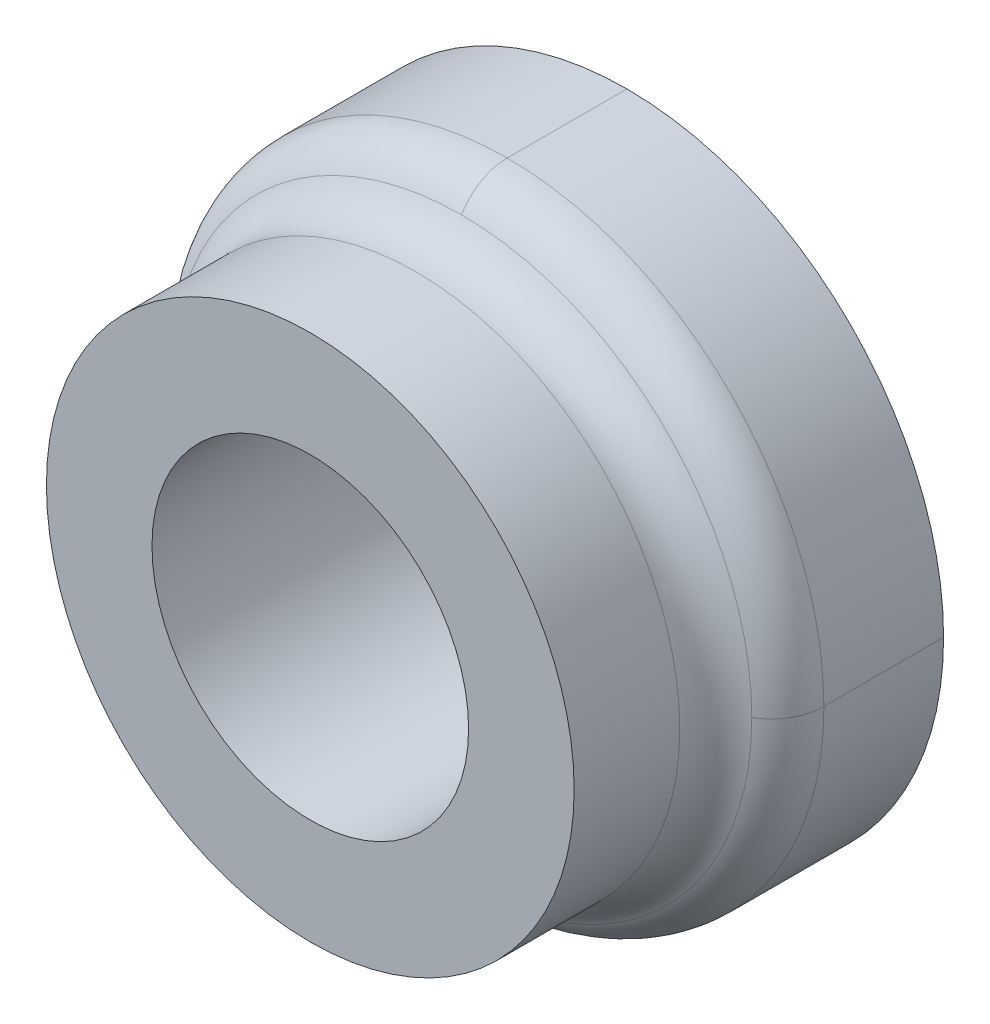
ISO-10303-21;
HEADER;
FILE_DESCRIPTION(('STEP AP214'),'2;1');
FILE_NAME('part.step','',(''),(''),'','','');
FILE_SCHEMA(('AUTOMOTIVE_DESIGN { 1 0 10303 214 1 1 1 1 }'));
ENDSEC;
DATA;
#1=APPLICATION_CONTEXT('core data for automotive mechanical design processes');
#2=APPLICATION_PROTOCOL_DEFINITION('international standard','automotive_design',2000,#1);
#3=PRODUCT_CONTEXT('',#1,'mechanical');
#4=PRODUCT('Part','Part','',(#3));
#5=PRODUCT_RELATED_PRODUCT_CATEGORY('part','',(#4));
#6=PRODUCT_DEFINITION_FORMATION('','',#4);
#7=PRODUCT_DEFINITION_CONTEXT('part definition',#1,'design');
#8=PRODUCT_DEFINITION('design','',#6,#7);
#9=PRODUCT_DEFINITION_SHAPE('','',#8);
#10=(LENGTH_UNIT() NAMED_UNIT(*) SI_UNIT(.MILLI.,.METRE.));
#11=(NAMED_UNIT(*) PLANE_ANGLE_UNIT() SI_UNIT($,.RADIAN.));
#12=(NAMED_UNIT(*) SI_UNIT($,.STERADIAN.) SOLID_ANGLE_UNIT());
#13=UNCERTAINTY_MEASURE_WITH_UNIT(LENGTH_MEASURE(1.E-05),#10,'distance_accuracy_value','');
#14=(GEOMETRIC_REPRESENTATION_CONTEXT(3) GLOBAL_UNCERTAINTY_ASSIGNED_CONTEXT((#13)) GLOBAL_UNIT_ASSIGNED_CONTEXT((#10,
#11,#12)) REPRESENTATION_CONTEXT('',''));
#15=CARTESIAN_POINT('',(0.,0.,0.));
#16=DIRECTION('',(0.,0.,1.));
#17=DIRECTION('',(1.,0.,0.));
#18=AXIS2_PLACEMENT_3D('',#15,#16,#17);
#19=CARTESIAN_POINT('',(0.,0.,3.));
#20=DIRECTION('',(0.,0.,-1.));
#21=DIRECTION('',(-1.,0.,0.));
#22=AXIS2_PLACEMENT_3D('',#19,#20,#21);
#23=CYLINDRICAL_SURFACE('',#22,1.5);
#24=CARTESIAN_POINT('',(0.,0.,0.5));
#25=DIRECTION('',(0.,0.,1.));
#26=DIRECTION('',(1.,0.,0.));
#27=AXIS2_PLACEMENT_3D('',#24,#25,#26);
#28=CIRCLE('',#27,1.5);
#29=CARTESIAN_POINT('',(1.5,0.,0.5));
#30=VERTEX_POINT('',#29);
#31=EDGE_CURVE('E11',#30,#30,#28,.F.);
#32=ORIENTED_EDGE('',*,*,#31,.T.);
#33=EDGE_LOOP('',(#32));
#34=FACE_BOUND('',#33,.T.);
#35=CARTESIAN_POINT('',(0.,0.,3.));
#36=DIRECTION('',(0.,0.,1.));
#37=DIRECTION('',(1.,0.,0.));
#38=AXIS2_PLACEMENT_3D('',#35,#36,#37);
#39=CIRCLE('',#38,1.5);
#40=CARTESIAN_POINT('',(1.5,0.,3.));
#41=VERTEX_POINT('',#40);
#42=EDGE_CURVE('E125',#41,#41,#39,.T.);
#43=ORIENTED_EDGE('',*,*,#42,.T.);
#44=EDGE_LOOP('',(#43));
#45=FACE_BOUND('',#44,.T.);
#46=ADVANCED_FACE('F41',(#34,#45),#23,.F.);
#47=CARTESIAN_POINT('',(0.,0.,3.));
#48=DIRECTION('',(0.,0.,-1.));
#49=DIRECTION('',(-1.,0.,0.));
#50=AXIS2_PLACEMENT_3D('',#47,#48,#49);
#51=CYLINDRICAL_SURFACE('',#50,2.5);
#52=CARTESIAN_POINT('',(0.,0.,2.));
#53=DIRECTION('',(0.,0.,1.));
#54=DIRECTION('',(1.,0.,0.));
#55=AXIS2_PLACEMENT_3D('',#52,#53,#54);
#56=CIRCLE('',#55,2.5);
#57=CARTESIAN_POINT('',(2.5,0.,2.));
#58=VERTEX_POINT('',#57);
#59=EDGE_CURVE('E128',#58,#58,#56,.T.);
#60=ORIENTED_EDGE('',*,*,#59,.T.);
#61=EDGE_LOOP('',(#60));
#62=FACE_BOUND('',#61,.T.);
#63=CARTESIAN_POINT('',(0.,0.,3.));
#64=DIRECTION('',(0.,0.,1.));
#65=DIRECTION('',(1.,0.,0.));
#66=AXIS2_PLACEMENT_3D('',#63,#64,#65);
#67=CIRCLE('',#66,2.5);
#68=CARTESIAN_POINT('',(2.5,0.,3.));
#69=VERTEX_POINT('',#68);
#70=EDGE_CURVE('E118',#69,#69,#67,.T.);
#71=ORIENTED_EDGE('',*,*,#70,.F.);
#72=EDGE_LOOP('',(#71));
#73=FACE_BOUND('',#72,.T.);
#74=ADVANCED_FACE('F173',(#62,#73),#51,.T.);
#75=CARTESIAN_POINT('',(0.,0.,3.));
#76=DIRECTION('',(0.,0.,1.));
#77=DIRECTION('',(1.,0.,0.));
#78=AXIS2_PLACEMENT_3D('',#75,#76,#77);
#79=PLANE('',#78);
#80=ORIENTED_EDGE('',*,*,#42,.F.);
#81=EDGE_LOOP('',(#80));
#82=FACE_BOUND('',#81,.T.);
#83=ORIENTED_EDGE('',*,*,#70,.T.);
#84=EDGE_LOOP('',(#83));
#85=FACE_BOUND('',#84,.T.);
#86=ADVANCED_FACE('F182',(#82,#85),#79,.T.);
#87=CARTESIAN_POINT('',(0.,0.,0.));
#88=DIRECTION('',(0.,0.,1.));
#89=DIRECTION('',(1.,0.,0.));
#90=AXIS2_PLACEMENT_3D('',#87,#88,#89);
#91=PLANE('',#90);
#92=CARTESIAN_POINT('',(0.,0.,0.));
#93=DIRECTION('',(0.,0.,1.));
#94=DIRECTION('',(1.,0.,0.));
#95=AXIS2_PLACEMENT_3D('',#92,#93,#94);
#96=CIRCLE('',#95,2.);
#97=CARTESIAN_POINT('',(2.,0.,0.));
#98=VERTEX_POINT('',#97);
#99=EDGE_CURVE('E47',#98,#98,#96,.T.);
#100=ORIENTED_EDGE('',*,*,#99,.T.);
#101=EDGE_LOOP('',(#100));
#102=FACE_BOUND('',#101,.T.);
#103=CARTESIAN_POINT('',(0.,0.,0.));
#104=DIRECTION('',(0.,0.,1.));
#105=DIRECTION('',(1.,0.,0.));
#106=AXIS2_PLACEMENT_3D('',#103,#104,#105);
#107=CIRCLE('',#106,3.);
#108=CARTESIAN_POINT('',(0.,-3.,0.));
#109=VERTEX_POINT('',#108);
#110=CARTESIAN_POINT('',(-3.,0.,0.));
#111=VERTEX_POINT('',#110);
#112=EDGE_CURVE('E99',#109,#111,#107,.F.);
#113=ORIENTED_EDGE('',*,*,#112,.T.);
#114=CARTESIAN_POINT('',(0.,0.,0.));
#115=DIRECTION('',(0.,0.,1.));
#116=DIRECTION('',(1.,0.,0.));
#117=AXIS2_PLACEMENT_3D('',#114,#115,#116);
#118=CIRCLE('',#117,3.);
#119=CARTESIAN_POINT('',(0.,3.,0.));
#120=VERTEX_POINT('',#119);
#121=EDGE_CURVE('E126',#111,#120,#118,.F.);
#122=ORIENTED_EDGE('',*,*,#121,.T.);
#123=CARTESIAN_POINT('',(0.,0.,0.));
#124=DIRECTION('',(0.,0.,1.));
#125=DIRECTION('',(1.,0.,0.));
#126=AXIS2_PLACEMENT_3D('',#123,#124,#125);
#127=CIRCLE('',#126,3.);
#128=CARTESIAN_POINT('',(3.,0.,0.));
#129=VERTEX_POINT('',#128);
#130=EDGE_CURVE('E103',#120,#129,#127,.F.);
#131=ORIENTED_EDGE('',*,*,#130,.T.);
#132=CARTESIAN_POINT('',(0.,0.,0.));
#133=DIRECTION('',(0.,0.,1.));
#134=DIRECTION('',(1.,0.,0.));
#135=AXIS2_PLACEMENT_3D('',#132,#133,#134);
#136=CIRCLE('',#135,3.);
#137=EDGE_CURVE('E92',#129,#109,#136,.F.);
#138=ORIENTED_EDGE('',*,*,#137,.T.);
#139=EDGE_LOOP('',(#113,#122,#131,#138));
#140=FACE_BOUND('',#139,.T.);
#141=ADVANCED_FACE('F100',(#102,#140),#91,.F.);
#142=CARTESIAN_POINT('',(0.,0.,1.5));
#143=DIRECTION('',(0.,0.,-1.));
#144=DIRECTION('',(-1.,0.,0.));
#145=AXIS2_PLACEMENT_3D('',#142,#143,#144);
#146=CYLINDRICAL_SURFACE('',#145,3.);
#147=DIRECTION('',(0.,0.,-1.));
#148=VECTOR('',#147,1.);
#149=CARTESIAN_POINT('',(3.,0.,1.5));
#150=LINE('',#149,#148);
#151=CARTESIAN_POINT('',(3.,0.,1.13397459621556));
#152=VERTEX_POINT('',#151);
#153=EDGE_CURVE('E111',#152,#129,#150,.T.);
#154=ORIENTED_EDGE('',*,*,#153,.F.);
#155=CARTESIAN_POINT('',(0.,0.,1.13397459621556));
#156=DIRECTION('',(0.,0.,-1.));
#157=DIRECTION('',(-1.,0.,0.));
#158=AXIS2_PLACEMENT_3D('',#155,#156,#157);
#159=CIRCLE('',#158,3.);
#160=CARTESIAN_POINT('',(0.,-3.,1.13397459621556));
#161=VERTEX_POINT('',#160);
#162=EDGE_CURVE('E109',#152,#161,#159,.T.);
#163=ORIENTED_EDGE('',*,*,#162,.T.);
#164=DIRECTION('',(0.,0.,-1.));
#165=VECTOR('',#164,1.);
#166=CARTESIAN_POINT('',(0.,-3.,1.5));
#167=LINE('',#166,#165);
#168=EDGE_CURVE('E110',#109,#161,#167,.F.);
#169=ORIENTED_EDGE('',*,*,#168,.F.);
#170=ORIENTED_EDGE('',*,*,#137,.F.);
#171=EDGE_LOOP('',(#154,#163,#169,#170));
#172=FACE_BOUND('',#171,.T.);
#173=ADVANCED_FACE('F107',(#172),#146,.T.);
#174=CARTESIAN_POINT('',(0.,0.,1.5));
#175=DIRECTION('',(0.,0.,1.));
#176=DIRECTION('',(1.,0.,0.));
#177=AXIS2_PLACEMENT_3D('',#174,#175,#176);
#178=CYLINDRICAL_SURFACE('',#177,3.);
#179=DIRECTION('',(0.,0.,-1.));
#180=VECTOR('',#179,1.);
#181=CARTESIAN_POINT('',(0.,3.,0.));
#182=LINE('',#181,#180);
#183=CARTESIAN_POINT('',(0.,3.,1.13397459621556));
#184=VERTEX_POINT('',#183);
#185=EDGE_CURVE('E113',#184,#120,#182,.T.);
#186=ORIENTED_EDGE('',*,*,#185,.F.);
#187=CARTESIAN_POINT('',(0.,0.,1.13397459621556));
#188=DIRECTION('',(0.,0.,-1.));
#189=DIRECTION('',(-1.,0.,0.));
#190=AXIS2_PLACEMENT_3D('',#187,#188,#189);
#191=CIRCLE('',#190,3.);
#192=EDGE_CURVE('E57',#184,#152,#191,.T.);
#193=ORIENTED_EDGE('',*,*,#192,.T.);
#194=ORIENTED_EDGE('',*,*,#153,.T.);
#195=ORIENTED_EDGE('',*,*,#130,.F.);
#196=EDGE_LOOP('',(#186,#193,#194,#195));
#197=FACE_BOUND('',#196,.T.);
#198=ADVANCED_FACE('F195',(#197),#178,.T.);
#199=CARTESIAN_POINT('',(0.,0.,1.5));
#200=DIRECTION('',(0.,0.,1.));
#201=DIRECTION('',(1.,0.,0.));
#202=AXIS2_PLACEMENT_3D('',#199,#200,#201);
#203=CYLINDRICAL_SURFACE('',#202,3.);
#204=ORIENTED_EDGE('',*,*,#168,.T.);
#205=CARTESIAN_POINT('',(0.,0.,1.13397459621556));
#206=DIRECTION('',(0.,0.,-1.));
#207=DIRECTION('',(-1.,0.,0.));
#208=AXIS2_PLACEMENT_3D('',#205,#206,#207);
#209=CIRCLE('',#208,3.);
#210=CARTESIAN_POINT('',(-3.,0.,1.13397459621556));
#211=VERTEX_POINT('',#210);
#212=EDGE_CURVE('E148',#161,#211,#209,.T.);
#213=ORIENTED_EDGE('',*,*,#212,.T.);
#214=DIRECTION('',(0.,0.,-1.));
#215=VECTOR('',#214,1.);
#216=CARTESIAN_POINT('',(-3.,0.,1.5));
#217=LINE('',#216,#215);
#218=EDGE_CURVE('E120',#111,#211,#217,.F.);
#219=ORIENTED_EDGE('',*,*,#218,.F.);
#220=ORIENTED_EDGE('',*,*,#112,.F.);
#221=EDGE_LOOP('',(#204,#213,#219,#220));
#222=FACE_BOUND('',#221,.T.);
#223=ADVANCED_FACE('F119',(#222),#203,.T.);
#224=CARTESIAN_POINT('',(0.,0.,1.5));
#225=DIRECTION('',(0.,0.,-1.));
#226=DIRECTION('',(-1.,0.,0.));
#227=AXIS2_PLACEMENT_3D('',#224,#225,#226);
#228=CYLINDRICAL_SURFACE('',#227,3.);
#229=ORIENTED_EDGE('',*,*,#218,.T.);
#230=CARTESIAN_POINT('',(0.,0.,1.13397459621556));
#231=DIRECTION('',(0.,0.,-1.));
#232=DIRECTION('',(-1.,0.,0.));
#233=AXIS2_PLACEMENT_3D('',#230,#231,#232);
#234=CIRCLE('',#233,3.);
#235=EDGE_CURVE('E61',#211,#184,#234,.T.);
#236=ORIENTED_EDGE('',*,*,#235,.T.);
#237=ORIENTED_EDGE('',*,*,#185,.T.);
#238=ORIENTED_EDGE('',*,*,#121,.F.);
#239=EDGE_LOOP('',(#229,#236,#237,#238));
#240=FACE_BOUND('',#239,.T.);
#241=ADVANCED_FACE('F189',(#240),#228,.T.);
#242=CARTESIAN_POINT('',(0.,0.,2.));
#243=DIRECTION('',(0.,0.,1.));
#244=DIRECTION('',(1.,0.,0.));
#245=AXIS2_PLACEMENT_3D('',#242,#243,#244);
#246=TOROIDAL_SURFACE('',#245,3.,0.5);
#247=CARTESIAN_POINT('',(0.,0.,1.56698729810778));
#248=DIRECTION('',(0.,0.,1.));
#249=DIRECTION('',(1.,0.,0.));
#250=AXIS2_PLACEMENT_3D('',#247,#248,#249);
#251=CIRCLE('',#250,2.75);
#252=CARTESIAN_POINT('',(0.,2.75,1.56698729810778));
#253=VERTEX_POINT('',#252);
#254=CARTESIAN_POINT('',(-2.75,0.,1.56698729810778));
#255=VERTEX_POINT('',#254);
#256=EDGE_CURVE('E143',#253,#255,#251,.T.);
#257=ORIENTED_EDGE('',*,*,#256,.T.);
#258=CARTESIAN_POINT('',(0.,0.,1.56698729810778));
#259=DIRECTION('',(0.,0.,1.));
#260=DIRECTION('',(1.,0.,0.));
#261=AXIS2_PLACEMENT_3D('',#258,#259,#260);
#262=CIRCLE('',#261,2.75);
#263=CARTESIAN_POINT('',(0.,-2.75,1.56698729810778));
#264=VERTEX_POINT('',#263);
#265=EDGE_CURVE('E141',#255,#264,#262,.T.);
#266=ORIENTED_EDGE('',*,*,#265,.T.);
#267=CARTESIAN_POINT('',(0.,0.,1.56698729810777));
#268=DIRECTION('',(0.,0.,1.));
#269=DIRECTION('',(1.,0.,0.));
#270=AXIS2_PLACEMENT_3D('',#267,#268,#269);
#271=CIRCLE('',#270,2.75);
#272=CARTESIAN_POINT('',(2.75,0.,1.56698729810778));
#273=VERTEX_POINT('',#272);
#274=EDGE_CURVE('E139',#264,#273,#271,.T.);
#275=ORIENTED_EDGE('',*,*,#274,.T.);
#276=CARTESIAN_POINT('',(0.,0.,1.56698729810778));
#277=DIRECTION('',(0.,0.,1.));
#278=DIRECTION('',(1.,0.,0.));
#279=AXIS2_PLACEMENT_3D('',#276,#277,#278);
#280=CIRCLE('',#279,2.75);
#281=EDGE_CURVE('E136',#273,#253,#280,.T.);
#282=ORIENTED_EDGE('',*,*,#281,.T.);
#283=EDGE_LOOP('',(#257,#266,#275,#282));
#284=FACE_BOUND('',#283,.T.);
#285=ORIENTED_EDGE('',*,*,#59,.F.);
#286=EDGE_LOOP('',(#285));
#287=FACE_BOUND('',#286,.T.);
#288=ADVANCED_FACE('F188',(#284,#287),#246,.F.);
#289=CARTESIAN_POINT('',(0.,0.,1.13397459621556));
#290=DIRECTION('',(0.,0.,-1.));
#291=DIRECTION('',(-1.,0.,0.));
#292=AXIS2_PLACEMENT_3D('',#289,#290,#291);
#293=TOROIDAL_SURFACE('',#292,2.5,0.5);
#294=CARTESIAN_POINT('',(2.5,0.,1.13397459621556));
#295=DIRECTION('',(0.,-1.,0.));
#296=DIRECTION('',(0.,0.,-1.));
#297=AXIS2_PLACEMENT_3D('',#294,#295,#296);
#298=CIRCLE('',#297,0.5);
#299=EDGE_CURVE('E154',#152,#273,#298,.T.);
#300=ORIENTED_EDGE('',*,*,#299,.F.);
#301=ORIENTED_EDGE('',*,*,#192,.F.);
#302=CARTESIAN_POINT('',(0.,2.5,1.13397459621556));
#303=DIRECTION('',(-1.,0.,0.));
#304=DIRECTION('',(0.,0.,1.));
#305=AXIS2_PLACEMENT_3D('',#302,#303,#304);
#306=CIRCLE('',#305,0.5);
#307=EDGE_CURVE('E134',#253,#184,#306,.T.);
#308=ORIENTED_EDGE('',*,*,#307,.F.);
#309=ORIENTED_EDGE('',*,*,#281,.F.);
#310=EDGE_LOOP('',(#300,#301,#308,#309));
#311=FACE_BOUND('',#310,.T.);
#312=ADVANCED_FACE('F200',(#311),#293,.T.);
#313=CARTESIAN_POINT('',(0.,0.,1.13397459621556));
#314=DIRECTION('',(0.,0.,-1.));
#315=DIRECTION('',(-1.,0.,0.));
#316=AXIS2_PLACEMENT_3D('',#313,#314,#315);
#317=TOROIDAL_SURFACE('',#316,2.5,0.5);
#318=ORIENTED_EDGE('',*,*,#307,.T.);
#319=ORIENTED_EDGE('',*,*,#235,.F.);
#320=CARTESIAN_POINT('',(-2.5,0.,1.13397459621556));
#321=DIRECTION('',(0.,-1.,0.));
#322=DIRECTION('',(0.,0.,-1.));
#323=AXIS2_PLACEMENT_3D('',#320,#321,#322);
#324=CIRCLE('',#323,0.5);
#325=EDGE_CURVE('E153',#255,#211,#324,.T.);
#326=ORIENTED_EDGE('',*,*,#325,.F.);
#327=ORIENTED_EDGE('',*,*,#256,.F.);
#328=EDGE_LOOP('',(#318,#319,#326,#327));
#329=FACE_BOUND('',#328,.T.);
#330=ADVANCED_FACE('F204',(#329),#317,.T.);
#331=CARTESIAN_POINT('',(0.,0.,1.13397459621556));
#332=DIRECTION('',(0.,0.,-1.));
#333=DIRECTION('',(-1.,0.,0.));
#334=AXIS2_PLACEMENT_3D('',#331,#332,#333);
#335=TOROIDAL_SURFACE('',#334,2.5,0.5);
#336=ORIENTED_EDGE('',*,*,#299,.T.);
#337=ORIENTED_EDGE('',*,*,#274,.F.);
#338=CARTESIAN_POINT('',(0.,-2.5,1.13397459621556));
#339=DIRECTION('',(-1.,0.,0.));
#340=DIRECTION('',(0.,0.,1.));
#341=AXIS2_PLACEMENT_3D('',#338,#339,#340);
#342=CIRCLE('',#341,0.5);
#343=EDGE_CURVE('E151',#161,#264,#342,.T.);
#344=ORIENTED_EDGE('',*,*,#343,.F.);
#345=ORIENTED_EDGE('',*,*,#162,.F.);
#346=EDGE_LOOP('',(#336,#337,#344,#345));
#347=FACE_BOUND('',#346,.T.);
#348=ADVANCED_FACE('F168',(#347),#335,.T.);
#349=CARTESIAN_POINT('',(0.,0.,1.13397459621556));
#350=DIRECTION('',(0.,0.,-1.));
#351=DIRECTION('',(-1.,0.,0.));
#352=AXIS2_PLACEMENT_3D('',#349,#350,#351);
#353=TOROIDAL_SURFACE('',#352,2.5,0.5);
#354=ORIENTED_EDGE('',*,*,#325,.T.);
#355=ORIENTED_EDGE('',*,*,#212,.F.);
#356=ORIENTED_EDGE('',*,*,#343,.T.);
#357=ORIENTED_EDGE('',*,*,#265,.F.);
#358=EDGE_LOOP('',(#354,#355,#356,#357));
#359=FACE_BOUND('',#358,.T.);
#360=ADVANCED_FACE('F163',(#359),#353,.T.);
#361=CARTESIAN_POINT('',(0.,0.,0.5));
#362=DIRECTION('',(0.,0.,1.));
#363=DIRECTION('',(1.,0.,0.));
#364=AXIS2_PLACEMENT_3D('',#361,#362,#363);
#365=TOROIDAL_SURFACE('',#364,2.,0.5);
#366=ORIENTED_EDGE('',*,*,#31,.F.);
#367=EDGE_LOOP('',(#366));
#368=FACE_BOUND('',#367,.T.);
#369=ORIENTED_EDGE('',*,*,#99,.F.);
#370=EDGE_LOOP('',(#369));
#371=FACE_BOUND('',#370,.T.);
#372=ADVANCED_FACE('F43',(#368,#371),#365,.T.);
#373=CLOSED_SHELL('',(#46,#74,#86,#141,#173,#198,#223,#241,#288,#312,#330,#348,#360,#372));
#374=MANIFOLD_SOLID_BREP('B2',#373);
#375=ADVANCED_BREP_SHAPE_REPRESENTATION('',(#18,#374),#14);
#376=SHAPE_DEFINITION_REPRESENTATION(#9,#375);
ENDSEC;
END-ISO-10303-21;
